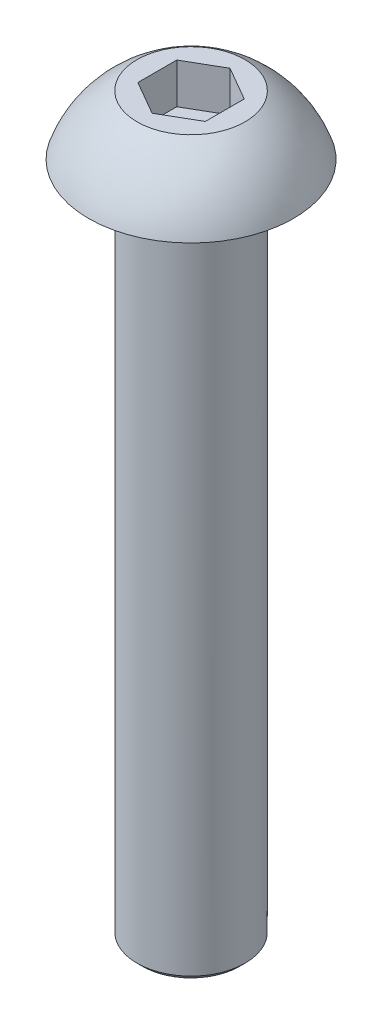
ISO-10303-21;
HEADER;
FILE_DESCRIPTION(('STEP AP214'),'2;1');
FILE_NAME('part.step','',(''),(''),'','','');
FILE_SCHEMA(('AUTOMOTIVE_DESIGN { 1 0 10303 214 1 1 1 1 }'));
ENDSEC;
DATA;
#1=APPLICATION_CONTEXT('core data for automotive mechanical design processes');
#2=APPLICATION_PROTOCOL_DEFINITION('international standard','automotive_design',2000,#1);
#3=PRODUCT_CONTEXT('',#1,'mechanical');
#4=PRODUCT('Part','Part','',(#3));
#5=PRODUCT_RELATED_PRODUCT_CATEGORY('part','',(#4));
#6=PRODUCT_DEFINITION_FORMATION('','',#4);
#7=PRODUCT_DEFINITION_CONTEXT('part definition',#1,'design');
#8=PRODUCT_DEFINITION('design','',#6,#7);
#9=PRODUCT_DEFINITION_SHAPE('','',#8);
#10=(LENGTH_UNIT() NAMED_UNIT(*) SI_UNIT(.MILLI.,.METRE.));
#11=(NAMED_UNIT(*) PLANE_ANGLE_UNIT() SI_UNIT($,.RADIAN.));
#12=(NAMED_UNIT(*) SI_UNIT($,.STERADIAN.) SOLID_ANGLE_UNIT());
#13=UNCERTAINTY_MEASURE_WITH_UNIT(LENGTH_MEASURE(1.E-05),#10,'distance_accuracy_value','');
#14=(GEOMETRIC_REPRESENTATION_CONTEXT(3) GLOBAL_UNCERTAINTY_ASSIGNED_CONTEXT((#13)) GLOBAL_UNIT_ASSIGNED_CONTEXT((#10,
#11,#12)) REPRESENTATION_CONTEXT('',''));
#15=CARTESIAN_POINT('',(0.,0.,0.));
#16=DIRECTION('',(0.,0.,1.));
#17=DIRECTION('',(1.,0.,0.));
#18=AXIS2_PLACEMENT_3D('',#15,#16,#17);
#19=CARTESIAN_POINT('',(0.,2.2,0.));
#20=DIRECTION('',(0.,1.,0.));
#21=DIRECTION('',(0.,0.,1.));
#22=AXIS2_PLACEMENT_3D('',#19,#20,#21);
#23=PLANE('',#22);
#24=DIRECTION('',(-0.866025403784439,0.,0.5));
#25=VECTOR('',#24,1.);
#26=CARTESIAN_POINT('',(0.,2.2,-1.44337567297406));
#27=LINE('',#26,#25);
#28=CARTESIAN_POINT('',(0.,2.2,-1.44337567297406));
#29=VERTEX_POINT('',#28);
#30=CARTESIAN_POINT('',(-1.25,2.2,-0.721687836487032));
#31=VERTEX_POINT('',#30);
#32=EDGE_CURVE('E32',#29,#31,#27,.T.);
#33=ORIENTED_EDGE('',*,*,#32,.F.);
#34=DIRECTION('',(-0.866025403784439,0.,-0.5));
#35=VECTOR('',#34,1.);
#36=CARTESIAN_POINT('',(1.25,2.2,-0.721687836487032));
#37=LINE('',#36,#35);
#38=CARTESIAN_POINT('',(1.25,2.2,-0.721687836487032));
#39=VERTEX_POINT('',#38);
#40=EDGE_CURVE('E115',#39,#29,#37,.T.);
#41=ORIENTED_EDGE('',*,*,#40,.F.);
#42=DIRECTION('',(0.,0.,-1.));
#43=VECTOR('',#42,1.);
#44=CARTESIAN_POINT('',(1.25,2.2,0.721687836487032));
#45=LINE('',#44,#43);
#46=CARTESIAN_POINT('',(1.25,2.2,0.721687836487032));
#47=VERTEX_POINT('',#46);
#48=EDGE_CURVE('E113',#47,#39,#45,.T.);
#49=ORIENTED_EDGE('',*,*,#48,.F.);
#50=DIRECTION('',(0.866025403784439,0.,-0.5));
#51=VECTOR('',#50,1.);
#52=CARTESIAN_POINT('',(0.,2.2,1.44337567297406));
#53=LINE('',#52,#51);
#54=CARTESIAN_POINT('',(0.,2.2,1.44337567297406));
#55=VERTEX_POINT('',#54);
#56=EDGE_CURVE('E80',#55,#47,#53,.T.);
#57=ORIENTED_EDGE('',*,*,#56,.F.);
#58=DIRECTION('',(0.866025403784439,0.,0.5));
#59=VECTOR('',#58,1.);
#60=CARTESIAN_POINT('',(-1.25,2.2,0.721687836487032));
#61=LINE('',#60,#59);
#62=CARTESIAN_POINT('',(-1.25,2.2,0.721687836487032));
#63=VERTEX_POINT('',#62);
#64=EDGE_CURVE('E109',#63,#55,#61,.T.);
#65=ORIENTED_EDGE('',*,*,#64,.F.);
#66=DIRECTION('',(0.,0.,1.));
#67=VECTOR('',#66,1.);
#68=CARTESIAN_POINT('',(-1.25,2.2,-0.721687836487032));
#69=LINE('',#68,#67);
#70=EDGE_CURVE('E106',#31,#63,#69,.T.);
#71=ORIENTED_EDGE('',*,*,#70,.F.);
#72=EDGE_LOOP('',(#33,#41,#49,#57,#65,#71));
#73=FACE_BOUND('',#72,.T.);
#74=CARTESIAN_POINT('',(0.,2.2,0.));
#75=DIRECTION('',(0.,1.,0.));
#76=DIRECTION('',(0.,0.,1.));
#77=AXIS2_PLACEMENT_3D('',#74,#75,#76);
#78=CIRCLE('',#77,2.);
#79=CARTESIAN_POINT('',(0.,2.2,2.));
#80=VERTEX_POINT('',#79);
#81=EDGE_CURVE('E130',#80,#80,#78,.T.);
#82=ORIENTED_EDGE('',*,*,#81,.T.);
#83=EDGE_LOOP('',(#82));
#84=FACE_BOUND('',#83,.T.);
#85=ADVANCED_FACE('F17',(#73,#84),#23,.T.);
#86=CARTESIAN_POINT('',(0.,-1.26766585145759,0.));
#87=DIRECTION('',(0.,1.,0.));
#88=DIRECTION('',(0.,0.,1.));
#89=AXIS2_PLACEMENT_3D('',#86,#87,#88);
#90=DEGENERATE_TOROIDAL_SURFACE('',#89,0.00618618155182093,4.,.T.);
#91=CARTESIAN_POINT('',(0.,0.,0.));
#92=DIRECTION('',(0.,1.,0.));
#93=DIRECTION('',(0.,0.,1.));
#94=AXIS2_PLACEMENT_3D('',#91,#92,#93);
#95=CIRCLE('',#94,3.8);
#96=CARTESIAN_POINT('',(0.,0.,3.8));
#97=VERTEX_POINT('',#96);
#98=EDGE_CURVE('E127',#97,#97,#95,.T.);
#99=ORIENTED_EDGE('',*,*,#98,.T.);
#100=EDGE_LOOP('',(#99));
#101=FACE_BOUND('',#100,.T.);
#102=ORIENTED_EDGE('',*,*,#81,.F.);
#103=EDGE_LOOP('',(#102));
#104=FACE_BOUND('',#103,.T.);
#105=ADVANCED_FACE('F149',(#101,#104),#90,.T.);
#106=CARTESIAN_POINT('',(-2.,0.,0.));
#107=DIRECTION('',(0.,-1.,0.));
#108=DIRECTION('',(0.,0.,-1.));
#109=AXIS2_PLACEMENT_3D('',#106,#107,#108);
#110=PLANE('',#109);
#111=CARTESIAN_POINT('',(0.,0.,0.));
#112=DIRECTION('',(0.,1.,0.));
#113=DIRECTION('',(0.,0.,1.));
#114=AXIS2_PLACEMENT_3D('',#111,#112,#113);
#115=CIRCLE('',#114,2.);
#116=CARTESIAN_POINT('',(0.,0.,2.));
#117=VERTEX_POINT('',#116);
#118=EDGE_CURVE('E119',#117,#117,#115,.T.);
#119=ORIENTED_EDGE('',*,*,#118,.T.);
#120=EDGE_LOOP('',(#119));
#121=FACE_BOUND('',#120,.T.);
#122=ORIENTED_EDGE('',*,*,#98,.F.);
#123=EDGE_LOOP('',(#122));
#124=FACE_BOUND('',#123,.T.);
#125=ADVANCED_FACE('F155',(#121,#124),#110,.T.);
#126=CARTESIAN_POINT('',(0.,60.1595545799248,0.));
#127=DIRECTION('',(0.,1.,0.));
#128=DIRECTION('',(0.,0.,1.));
#129=AXIS2_PLACEMENT_3D('',#126,#127,#128);
#130=CYLINDRICAL_SURFACE('',#129,2.);
#131=CARTESIAN_POINT('',(0.,-24.8,0.));
#132=DIRECTION('',(0.,-1.,0.));
#133=DIRECTION('',(0.,0.,-1.));
#134=AXIS2_PLACEMENT_3D('',#131,#132,#133);
#135=CIRCLE('',#134,2.);
#136=CARTESIAN_POINT('',(0.,-24.8,-2.));
#137=VERTEX_POINT('',#136);
#138=EDGE_CURVE('E25',#137,#137,#135,.F.);
#139=ORIENTED_EDGE('',*,*,#138,.T.);
#140=EDGE_LOOP('',(#139));
#141=FACE_BOUND('',#140,.T.);
#142=ORIENTED_EDGE('',*,*,#118,.F.);
#143=EDGE_LOOP('',(#142));
#144=FACE_BOUND('',#143,.T.);
#145=ADVANCED_FACE('F135',(#141,#144),#130,.T.);
#146=CARTESIAN_POINT('',(0.,-25.,0.));
#147=DIRECTION('',(0.,-1.,0.));
#148=DIRECTION('',(0.,0.,-1.));
#149=AXIS2_PLACEMENT_3D('',#146,#147,#148);
#150=PLANE('',#149);
#151=CARTESIAN_POINT('',(0.,-25.,0.));
#152=DIRECTION('',(0.,-1.,0.));
#153=DIRECTION('',(0.,0.,-1.));
#154=AXIS2_PLACEMENT_3D('',#151,#152,#153);
#155=CIRCLE('',#154,1.8);
#156=CARTESIAN_POINT('',(0.,-25.,-1.8));
#157=VERTEX_POINT('',#156);
#158=EDGE_CURVE('E11',#157,#157,#155,.T.);
#159=ORIENTED_EDGE('',*,*,#158,.T.);
#160=EDGE_LOOP('',(#159));
#161=FACE_BOUND('',#160,.T.);
#162=ADVANCED_FACE('F165',(#161),#150,.T.);
#163=CARTESIAN_POINT('',(0.,0.7,-1.44337567297406));
#164=DIRECTION('',(-0.5,0.,-0.866025403784439));
#165=DIRECTION('',(-0.866025403784439,0.,0.5));
#166=AXIS2_PLACEMENT_3D('',#163,#164,#165);
#167=PLANE('',#166);
#168=ORIENTED_EDGE('',*,*,#32,.T.);
#169=DIRECTION('',(0.,1.,0.));
#170=VECTOR('',#169,1.);
#171=CARTESIAN_POINT('',(-1.25,0.7,-0.721687836487032));
#172=LINE('',#171,#170);
#173=CARTESIAN_POINT('',(-1.25,0.7,-0.721687836487032));
#174=VERTEX_POINT('',#173);
#175=EDGE_CURVE('E62',#174,#31,#172,.T.);
#176=ORIENTED_EDGE('',*,*,#175,.F.);
#177=DIRECTION('',(-0.866025403784439,0.,0.5));
#178=VECTOR('',#177,1.);
#179=CARTESIAN_POINT('',(0.,0.7,-1.44337567297406));
#180=LINE('',#179,#178);
#181=CARTESIAN_POINT('',(0.,0.7,-1.44337567297406));
#182=VERTEX_POINT('',#181);
#183=EDGE_CURVE('E117',#182,#174,#180,.T.);
#184=ORIENTED_EDGE('',*,*,#183,.F.);
#185=DIRECTION('',(0.,1.,0.));
#186=VECTOR('',#185,1.);
#187=CARTESIAN_POINT('',(0.,0.7,-1.44337567297406));
#188=LINE('',#187,#186);
#189=EDGE_CURVE('E40',#182,#29,#188,.T.);
#190=ORIENTED_EDGE('',*,*,#189,.T.);
#191=EDGE_LOOP('',(#168,#176,#184,#190));
#192=FACE_BOUND('',#191,.T.);
#193=ADVANCED_FACE('F168',(#192),#167,.F.);
#194=CARTESIAN_POINT('',(1.25,0.7,-0.721687836487032));
#195=DIRECTION('',(0.5,0.,-0.866025403784439));
#196=DIRECTION('',(-0.866025403784439,0.,-0.5));
#197=AXIS2_PLACEMENT_3D('',#194,#195,#196);
#198=PLANE('',#197);
#199=ORIENTED_EDGE('',*,*,#40,.T.);
#200=ORIENTED_EDGE('',*,*,#189,.F.);
#201=DIRECTION('',(-0.866025403784439,0.,-0.5));
#202=VECTOR('',#201,1.);
#203=CARTESIAN_POINT('',(1.25,0.7,-0.721687836487032));
#204=LINE('',#203,#202);
#205=CARTESIAN_POINT('',(1.25,0.7,-0.721687836487032));
#206=VERTEX_POINT('',#205);
#207=EDGE_CURVE('E92',#206,#182,#204,.T.);
#208=ORIENTED_EDGE('',*,*,#207,.F.);
#209=DIRECTION('',(0.,1.,0.));
#210=VECTOR('',#209,1.);
#211=CARTESIAN_POINT('',(1.25,0.7,-0.721687836487032));
#212=LINE('',#211,#210);
#213=EDGE_CURVE('E84',#206,#39,#212,.T.);
#214=ORIENTED_EDGE('',*,*,#213,.T.);
#215=EDGE_LOOP('',(#199,#200,#208,#214));
#216=FACE_BOUND('',#215,.T.);
#217=ADVANCED_FACE('F172',(#216),#198,.F.);
#218=CARTESIAN_POINT('',(1.25,0.7,0.721687836487032));
#219=DIRECTION('',(1.,0.,0.));
#220=DIRECTION('',(0.,0.,-1.));
#221=AXIS2_PLACEMENT_3D('',#218,#219,#220);
#222=PLANE('',#221);
#223=ORIENTED_EDGE('',*,*,#48,.T.);
#224=ORIENTED_EDGE('',*,*,#213,.F.);
#225=DIRECTION('',(0.,0.,-1.));
#226=VECTOR('',#225,1.);
#227=CARTESIAN_POINT('',(1.25,0.7,0.721687836487032));
#228=LINE('',#227,#226);
#229=CARTESIAN_POINT('',(1.25,0.7,0.721687836487032));
#230=VERTEX_POINT('',#229);
#231=EDGE_CURVE('E88',#230,#206,#228,.T.);
#232=ORIENTED_EDGE('',*,*,#231,.F.);
#233=DIRECTION('',(0.,1.,0.));
#234=VECTOR('',#233,1.);
#235=CARTESIAN_POINT('',(1.25,0.7,0.721687836487032));
#236=LINE('',#235,#234);
#237=EDGE_CURVE('E73',#230,#47,#236,.T.);
#238=ORIENTED_EDGE('',*,*,#237,.T.);
#239=EDGE_LOOP('',(#223,#224,#232,#238));
#240=FACE_BOUND('',#239,.T.);
#241=ADVANCED_FACE('F89',(#240),#222,.F.);
#242=CARTESIAN_POINT('',(0.,0.7,1.44337567297406));
#243=DIRECTION('',(0.5,0.,0.866025403784438));
#244=DIRECTION('',(0.866025403784439,0.,-0.5));
#245=AXIS2_PLACEMENT_3D('',#242,#243,#244);
#246=PLANE('',#245);
#247=ORIENTED_EDGE('',*,*,#56,.T.);
#248=ORIENTED_EDGE('',*,*,#237,.F.);
#249=DIRECTION('',(0.866025403784439,0.,-0.5));
#250=VECTOR('',#249,1.);
#251=CARTESIAN_POINT('',(0.,0.7,1.44337567297406));
#252=LINE('',#251,#250);
#253=CARTESIAN_POINT('',(0.,0.7,1.44337567297406));
#254=VERTEX_POINT('',#253);
#255=EDGE_CURVE('E77',#254,#230,#252,.T.);
#256=ORIENTED_EDGE('',*,*,#255,.F.);
#257=DIRECTION('',(0.,1.,0.));
#258=VECTOR('',#257,1.);
#259=CARTESIAN_POINT('',(0.,0.7,1.44337567297406));
#260=LINE('',#259,#258);
#261=EDGE_CURVE('E85',#254,#55,#260,.T.);
#262=ORIENTED_EDGE('',*,*,#261,.T.);
#263=EDGE_LOOP('',(#247,#248,#256,#262));
#264=FACE_BOUND('',#263,.T.);
#265=ADVANCED_FACE('F75',(#264),#246,.F.);
#266=CARTESIAN_POINT('',(-1.25,0.7,0.721687836487032));
#267=DIRECTION('',(-0.5,0.,0.866025403784439));
#268=DIRECTION('',(0.866025403784439,0.,0.5));
#269=AXIS2_PLACEMENT_3D('',#266,#267,#268);
#270=PLANE('',#269);
#271=ORIENTED_EDGE('',*,*,#64,.T.);
#272=ORIENTED_EDGE('',*,*,#261,.F.);
#273=DIRECTION('',(0.866025403784439,0.,0.5));
#274=VECTOR('',#273,1.);
#275=CARTESIAN_POINT('',(-1.25,0.7,0.721687836487032));
#276=LINE('',#275,#274);
#277=CARTESIAN_POINT('',(-1.25,0.7,0.721687836487032));
#278=VERTEX_POINT('',#277);
#279=EDGE_CURVE('E98',#278,#254,#276,.T.);
#280=ORIENTED_EDGE('',*,*,#279,.F.);
#281=DIRECTION('',(0.,1.,0.));
#282=VECTOR('',#281,1.);
#283=CARTESIAN_POINT('',(-1.25,0.7,0.721687836487032));
#284=LINE('',#283,#282);
#285=EDGE_CURVE('E122',#278,#63,#284,.T.);
#286=ORIENTED_EDGE('',*,*,#285,.T.);
#287=EDGE_LOOP('',(#271,#272,#280,#286));
#288=FACE_BOUND('',#287,.T.);
#289=ADVANCED_FACE('F175',(#288),#270,.F.);
#290=CARTESIAN_POINT('',(-1.25,0.7,-0.721687836487032));
#291=DIRECTION('',(-1.,0.,0.));
#292=DIRECTION('',(0.,0.,1.));
#293=AXIS2_PLACEMENT_3D('',#290,#291,#292);
#294=PLANE('',#293);
#295=ORIENTED_EDGE('',*,*,#70,.T.);
#296=ORIENTED_EDGE('',*,*,#285,.F.);
#297=DIRECTION('',(0.,0.,1.));
#298=VECTOR('',#297,1.);
#299=CARTESIAN_POINT('',(-1.25,0.7,-0.721687836487032));
#300=LINE('',#299,#298);
#301=EDGE_CURVE('E100',#174,#278,#300,.T.);
#302=ORIENTED_EDGE('',*,*,#301,.F.);
#303=ORIENTED_EDGE('',*,*,#175,.T.);
#304=EDGE_LOOP('',(#295,#296,#302,#303));
#305=FACE_BOUND('',#304,.T.);
#306=ADVANCED_FACE('F145',(#305),#294,.F.);
#307=CARTESIAN_POINT('',(0.,0.7,0.));
#308=DIRECTION('',(0.,1.,0.));
#309=DIRECTION('',(0.,0.,1.));
#310=AXIS2_PLACEMENT_3D('',#307,#308,#309);
#311=PLANE('',#310);
#312=ORIENTED_EDGE('',*,*,#183,.T.);
#313=ORIENTED_EDGE('',*,*,#301,.T.);
#314=ORIENTED_EDGE('',*,*,#279,.T.);
#315=ORIENTED_EDGE('',*,*,#255,.T.);
#316=ORIENTED_EDGE('',*,*,#231,.T.);
#317=ORIENTED_EDGE('',*,*,#207,.T.);
#318=EDGE_LOOP('',(#312,#313,#314,#315,#316,#317));
#319=FACE_BOUND('',#318,.T.);
#320=ADVANCED_FACE('F95',(#319),#311,.T.);
#321=CARTESIAN_POINT('',(0.,-24.8,0.));
#322=DIRECTION('',(0.,1.,0.));
#323=DIRECTION('',(0.,0.,1.));
#324=AXIS2_PLACEMENT_3D('',#321,#322,#323);
#325=CONICAL_SURFACE('',#324,2.,0.785398163397438);
#326=ORIENTED_EDGE('',*,*,#158,.F.);
#327=EDGE_LOOP('',(#326));
#328=FACE_BOUND('',#327,.T.);
#329=ORIENTED_EDGE('',*,*,#138,.F.);
#330=EDGE_LOOP('',(#329));
#331=FACE_BOUND('',#330,.T.);
#332=ADVANCED_FACE('F19',(#328,#331),#325,.T.);
#333=CLOSED_SHELL('',(#85,#105,#125,#145,#162,#193,#217,#241,#265,#289,#306,#320,#332));
#334=MANIFOLD_SOLID_BREP('B1',#333);
#335=ADVANCED_BREP_SHAPE_REPRESENTATION('',(#18,#334),#14);
#336=SHAPE_DEFINITION_REPRESENTATION(#9,#335);
ENDSEC;
END-ISO-10303-21;
